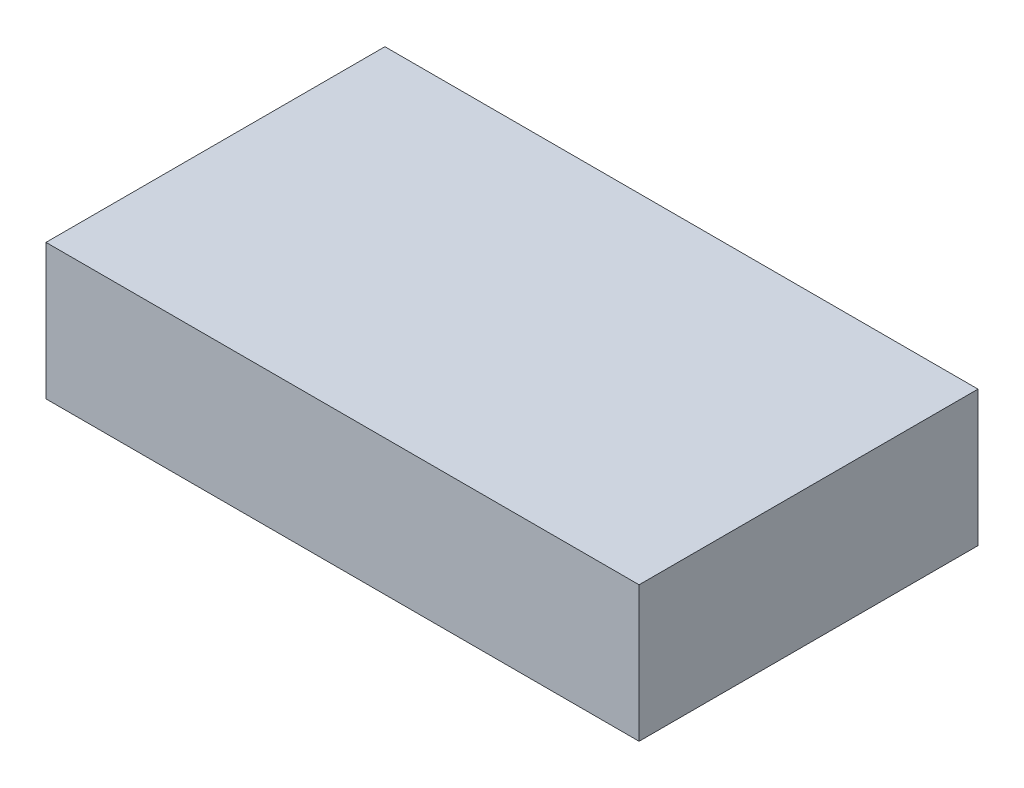
ISO-10303-21;
HEADER;
FILE_DESCRIPTION(('STEP AP214'),'2;1');
FILE_NAME('part.step','',(''),(''),'','','');
FILE_SCHEMA(('AUTOMOTIVE_DESIGN { 1 0 10303 214 1 1 1 1 }'));
ENDSEC;
DATA;
#1=APPLICATION_CONTEXT('core data for automotive mechanical design processes');
#2=APPLICATION_PROTOCOL_DEFINITION('international standard','automotive_design',2000,#1);
#3=PRODUCT_CONTEXT('',#1,'mechanical');
#4=PRODUCT('Part','Part','',(#3));
#5=PRODUCT_RELATED_PRODUCT_CATEGORY('part','',(#4));
#6=PRODUCT_DEFINITION_FORMATION('','',#4);
#7=PRODUCT_DEFINITION_CONTEXT('part definition',#1,'design');
#8=PRODUCT_DEFINITION('design','',#6,#7);
#9=PRODUCT_DEFINITION_SHAPE('','',#8);
#10=(LENGTH_UNIT() NAMED_UNIT(*) SI_UNIT(.MILLI.,.METRE.));
#11=(NAMED_UNIT(*) PLANE_ANGLE_UNIT() SI_UNIT($,.RADIAN.));
#12=(NAMED_UNIT(*) SI_UNIT($,.STERADIAN.) SOLID_ANGLE_UNIT());
#13=UNCERTAINTY_MEASURE_WITH_UNIT(LENGTH_MEASURE(1.E-05),#10,'distance_accuracy_value','');
#14=(GEOMETRIC_REPRESENTATION_CONTEXT(3) GLOBAL_UNCERTAINTY_ASSIGNED_CONTEXT((#13)) GLOBAL_UNIT_ASSIGNED_CONTEXT((#10,
#11,#12)) REPRESENTATION_CONTEXT('',''));
#15=CARTESIAN_POINT('',(0.,0.,0.));
#16=DIRECTION('',(0.,0.,1.));
#17=DIRECTION('',(1.,0.,0.));
#18=AXIS2_PLACEMENT_3D('',#15,#16,#17);
#19=CARTESIAN_POINT('',(-639.032258064516,400.,228.064516129032));
#20=DIRECTION('',(1.,0.,0.));
#21=DIRECTION('',(0.,0.,-1.));
#22=AXIS2_PLACEMENT_3D('',#19,#20,#21);
#23=PLANE('',#22);
#24=DIRECTION('',(0.,0.,1.));
#25=VECTOR('',#24,1.);
#26=CARTESIAN_POINT('',(-639.032258064516,0.,228.064516129032));
#27=LINE('',#26,#25);
#28=CARTESIAN_POINT('',(-639.032258064516,0.,-771.935483870968));
#29=VERTEX_POINT('',#28);
#30=CARTESIAN_POINT('',(-639.032258064516,0.,228.064516129032));
#31=VERTEX_POINT('',#30);
#32=EDGE_CURVE('E107',#29,#31,#27,.T.);
#33=ORIENTED_EDGE('',*,*,#32,.T.);
#34=DIRECTION('',(0.,-1.,0.));
#35=VECTOR('',#34,1.);
#36=CARTESIAN_POINT('',(-639.032258064516,400.,228.064516129032));
#37=LINE('',#36,#35);
#38=CARTESIAN_POINT('',(-639.032258064516,400.,228.064516129032));
#39=VERTEX_POINT('',#38);
#40=EDGE_CURVE('E11',#39,#31,#37,.T.);
#41=ORIENTED_EDGE('',*,*,#40,.F.);
#42=DIRECTION('',(0.,0.,1.));
#43=VECTOR('',#42,1.);
#44=CARTESIAN_POINT('',(-639.032258064516,400.,228.064516129032));
#45=LINE('',#44,#43);
#46=CARTESIAN_POINT('',(-639.032258064516,400.,-771.935483870968));
#47=VERTEX_POINT('',#46);
#48=EDGE_CURVE('E91',#47,#39,#45,.T.);
#49=ORIENTED_EDGE('',*,*,#48,.F.);
#50=DIRECTION('',(0.,-1.,0.));
#51=VECTOR('',#50,1.);
#52=CARTESIAN_POINT('',(-639.032258064516,400.,-771.935483870968));
#53=LINE('',#52,#51);
#54=EDGE_CURVE('E103',#47,#29,#53,.T.);
#55=ORIENTED_EDGE('',*,*,#54,.T.);
#56=EDGE_LOOP('',(#33,#41,#49,#55));
#57=FACE_BOUND('',#56,.T.);
#58=ADVANCED_FACE('F39',(#57),#23,.F.);
#59=CARTESIAN_POINT('',(-639.032258064516,400.,228.064516129032));
#60=DIRECTION('',(0.,0.,-1.));
#61=DIRECTION('',(-1.,0.,0.));
#62=AXIS2_PLACEMENT_3D('',#59,#60,#61);
#63=PLANE('',#62);
#64=DIRECTION('',(1.,0.,0.));
#65=VECTOR('',#64,1.);
#66=CARTESIAN_POINT('',(-639.032258064516,0.,228.064516129032));
#67=LINE('',#66,#65);
#68=CARTESIAN_POINT('',(1110.96774193548,0.,228.064516129032));
#69=VERTEX_POINT('',#68);
#70=EDGE_CURVE('E96',#31,#69,#67,.T.);
#71=ORIENTED_EDGE('',*,*,#70,.T.);
#72=DIRECTION('',(0.,-1.,0.));
#73=VECTOR('',#72,1.);
#74=CARTESIAN_POINT('',(1110.96774193548,400.,228.064516129032));
#75=LINE('',#74,#73);
#76=CARTESIAN_POINT('',(1110.96774193548,400.,228.064516129032));
#77=VERTEX_POINT('',#76);
#78=EDGE_CURVE('E48',#77,#69,#75,.T.);
#79=ORIENTED_EDGE('',*,*,#78,.F.);
#80=DIRECTION('',(1.,0.,0.));
#81=VECTOR('',#80,1.);
#82=CARTESIAN_POINT('',(-639.032258064516,400.,228.064516129032));
#83=LINE('',#82,#81);
#84=EDGE_CURVE('E86',#39,#77,#83,.T.);
#85=ORIENTED_EDGE('',*,*,#84,.F.);
#86=ORIENTED_EDGE('',*,*,#40,.T.);
#87=EDGE_LOOP('',(#71,#79,#85,#86));
#88=FACE_BOUND('',#87,.T.);
#89=ADVANCED_FACE('F95',(#88),#63,.F.);
#90=CARTESIAN_POINT('',(1110.96774193548,400.,-771.935483870968));
#91=DIRECTION('',(-1.,0.,0.));
#92=DIRECTION('',(0.,0.,1.));
#93=AXIS2_PLACEMENT_3D('',#90,#91,#92);
#94=PLANE('',#93);
#95=DIRECTION('',(0.,0.,-1.));
#96=VECTOR('',#95,1.);
#97=CARTESIAN_POINT('',(1110.96774193548,0.,-771.935483870968));
#98=LINE('',#97,#96);
#99=CARTESIAN_POINT('',(1110.96774193548,0.,-771.935483870968));
#100=VERTEX_POINT('',#99);
#101=EDGE_CURVE('E73',#69,#100,#98,.T.);
#102=ORIENTED_EDGE('',*,*,#101,.T.);
#103=DIRECTION('',(0.,-1.,0.));
#104=VECTOR('',#103,1.);
#105=CARTESIAN_POINT('',(1110.96774193548,400.,-771.935483870968));
#106=LINE('',#105,#104);
#107=CARTESIAN_POINT('',(1110.96774193548,400.,-771.935483870968));
#108=VERTEX_POINT('',#107);
#109=EDGE_CURVE('E98',#108,#100,#106,.T.);
#110=ORIENTED_EDGE('',*,*,#109,.F.);
#111=DIRECTION('',(0.,0.,-1.));
#112=VECTOR('',#111,1.);
#113=CARTESIAN_POINT('',(1110.96774193548,400.,-771.935483870968));
#114=LINE('',#113,#112);
#115=EDGE_CURVE('E89',#77,#108,#114,.T.);
#116=ORIENTED_EDGE('',*,*,#115,.F.);
#117=ORIENTED_EDGE('',*,*,#78,.T.);
#118=EDGE_LOOP('',(#102,#110,#116,#117));
#119=FACE_BOUND('',#118,.T.);
#120=ADVANCED_FACE('F99',(#119),#94,.F.);
#121=CARTESIAN_POINT('',(-639.032258064516,400.,-771.935483870968));
#122=DIRECTION('',(0.,0.,1.));
#123=DIRECTION('',(1.,0.,0.));
#124=AXIS2_PLACEMENT_3D('',#121,#122,#123);
#125=PLANE('',#124);
#126=DIRECTION('',(-1.,0.,0.));
#127=VECTOR('',#126,1.);
#128=CARTESIAN_POINT('',(-639.032258064516,0.,-771.935483870968));
#129=LINE('',#128,#127);
#130=EDGE_CURVE('E79',#100,#29,#129,.T.);
#131=ORIENTED_EDGE('',*,*,#130,.T.);
#132=ORIENTED_EDGE('',*,*,#54,.F.);
#133=DIRECTION('',(-1.,0.,0.));
#134=VECTOR('',#133,1.);
#135=CARTESIAN_POINT('',(-639.032258064516,400.,-771.935483870968));
#136=LINE('',#135,#134);
#137=EDGE_CURVE('E56',#108,#47,#136,.T.);
#138=ORIENTED_EDGE('',*,*,#137,.F.);
#139=ORIENTED_EDGE('',*,*,#109,.T.);
#140=EDGE_LOOP('',(#131,#132,#138,#139));
#141=FACE_BOUND('',#140,.T.);
#142=ADVANCED_FACE('F120',(#141),#125,.F.);
#143=CARTESIAN_POINT('',(0.,400.,0.));
#144=DIRECTION('',(0.,-1.,0.));
#145=DIRECTION('',(0.,0.,-1.));
#146=AXIS2_PLACEMENT_3D('',#143,#144,#145);
#147=PLANE('',#146);
#148=ORIENTED_EDGE('',*,*,#48,.T.);
#149=ORIENTED_EDGE('',*,*,#84,.T.);
#150=ORIENTED_EDGE('',*,*,#115,.T.);
#151=ORIENTED_EDGE('',*,*,#137,.T.);
#152=EDGE_LOOP('',(#148,#149,#150,#151));
#153=FACE_BOUND('',#152,.T.);
#154=ADVANCED_FACE('F87',(#153),#147,.F.);
#155=CARTESIAN_POINT('',(0.,0.,0.));
#156=DIRECTION('',(0.,-1.,0.));
#157=DIRECTION('',(0.,0.,-1.));
#158=AXIS2_PLACEMENT_3D('',#155,#156,#157);
#159=PLANE('',#158);
#160=ORIENTED_EDGE('',*,*,#32,.F.);
#161=ORIENTED_EDGE('',*,*,#130,.F.);
#162=ORIENTED_EDGE('',*,*,#101,.F.);
#163=ORIENTED_EDGE('',*,*,#70,.F.);
#164=EDGE_LOOP('',(#160,#161,#162,#163));
#165=FACE_BOUND('',#164,.T.);
#166=ADVANCED_FACE('F123',(#165),#159,.T.);
#167=CLOSED_SHELL('',(#58,#89,#120,#142,#154,#166));
#168=MANIFOLD_SOLID_BREP('B2',#167);
#169=ADVANCED_BREP_SHAPE_REPRESENTATION('',(#18,#168),#14);
#170=SHAPE_DEFINITION_REPRESENTATION(#9,#169);
ENDSEC;
END-ISO-10303-21;
